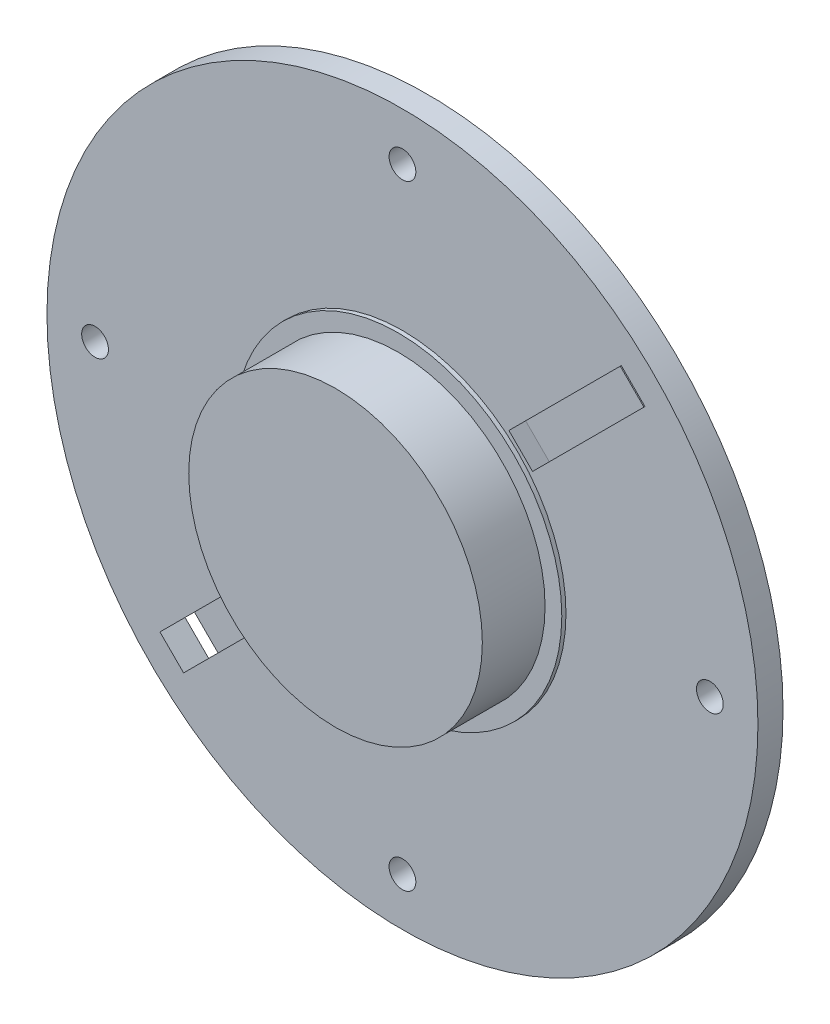
ISO-10303-21;
HEADER;
FILE_DESCRIPTION(('STEP AP214'),'2;1');
FILE_NAME('part.step','',(''),(''),'','','');
FILE_SCHEMA(('AUTOMOTIVE_DESIGN { 1 0 10303 214 1 1 1 1 }'));
ENDSEC;
DATA;
#1=APPLICATION_CONTEXT('core data for automotive mechanical design processes');
#2=APPLICATION_PROTOCOL_DEFINITION('international standard','automotive_design',2000,#1);
#3=PRODUCT_CONTEXT('',#1,'mechanical');
#4=PRODUCT('Part','Part','',(#3));
#5=PRODUCT_RELATED_PRODUCT_CATEGORY('part','',(#4));
#6=PRODUCT_DEFINITION_FORMATION('','',#4);
#7=PRODUCT_DEFINITION_CONTEXT('part definition',#1,'design');
#8=PRODUCT_DEFINITION('design','',#6,#7);
#9=PRODUCT_DEFINITION_SHAPE('','',#8);
#10=(LENGTH_UNIT() NAMED_UNIT(*) SI_UNIT(.MILLI.,.METRE.));
#11=(NAMED_UNIT(*) PLANE_ANGLE_UNIT() SI_UNIT($,.RADIAN.));
#12=(NAMED_UNIT(*) SI_UNIT($,.STERADIAN.) SOLID_ANGLE_UNIT());
#13=UNCERTAINTY_MEASURE_WITH_UNIT(LENGTH_MEASURE(1.E-05),#10,'distance_accuracy_value','');
#14=(GEOMETRIC_REPRESENTATION_CONTEXT(3) GLOBAL_UNCERTAINTY_ASSIGNED_CONTEXT((#13)) GLOBAL_UNIT_ASSIGNED_CONTEXT((#10,
#11,#12)) REPRESENTATION_CONTEXT('',''));
#15=CARTESIAN_POINT('',(0.,0.,0.));
#16=DIRECTION('',(0.,0.,1.));
#17=DIRECTION('',(1.,0.,0.));
#18=AXIS2_PLACEMENT_3D('',#15,#16,#17);
#19=CARTESIAN_POINT('',(0.,42.5,3.));
#20=DIRECTION('',(0.,0.,-1.));
#21=DIRECTION('',(-1.,0.,0.));
#22=AXIS2_PLACEMENT_3D('',#19,#20,#21);
#23=PLANE('',#22);
#24=DIRECTION('',(0.707106781186546,0.707106781186549,0.));
#25=VECTOR('',#24,1.);
#26=CARTESIAN_POINT('',(28.9913780286484,26.1629509039023,3.));
#27=LINE('',#26,#25);
#28=CARTESIAN_POINT('',(15.556349186104,12.7279220613579,3.));
#29=VERTEX_POINT('',#28);
#30=CARTESIAN_POINT('',(28.9913780286484,26.1629509039023,3.));
#31=VERTEX_POINT('',#30);
#32=EDGE_CURVE('E239',#29,#31,#27,.T.);
#33=ORIENTED_EDGE('',*,*,#32,.F.);
#34=DIRECTION('',(-0.707106781186549,0.707106781186546,0.));
#35=VECTOR('',#34,1.);
#36=CARTESIAN_POINT('',(15.556349186104,12.7279220613579,3.));
#37=LINE('',#36,#35);
#38=CARTESIAN_POINT('',(12.7279220613578,15.5563491861041,3.));
#39=VERTEX_POINT('',#38);
#40=EDGE_CURVE('E306',#29,#39,#37,.T.);
#41=ORIENTED_EDGE('',*,*,#40,.T.);
#42=DIRECTION('',(0.707106781186546,0.707106781186549,0.));
#43=VECTOR('',#42,1.);
#44=CARTESIAN_POINT('',(26.1629509039022,28.9913780286485,3.));
#45=LINE('',#44,#43);
#46=CARTESIAN_POINT('',(26.1629509039022,28.9913780286485,3.));
#47=VERTEX_POINT('',#46);
#48=EDGE_CURVE('E281',#39,#47,#45,.T.);
#49=ORIENTED_EDGE('',*,*,#48,.T.);
#50=DIRECTION('',(-0.707106781186549,0.707106781186546,0.));
#51=VECTOR('',#50,1.);
#52=CARTESIAN_POINT('',(28.9913780286484,26.1629509039023,3.));
#53=LINE('',#52,#51);
#54=EDGE_CURVE('E304',#31,#47,#53,.T.);
#55=ORIENTED_EDGE('',*,*,#54,.F.);
#56=EDGE_LOOP('',(#33,#41,#49,#55));
#57=FACE_BOUND('',#56,.T.);
#58=CARTESIAN_POINT('',(0.,36.75,3.));
#59=DIRECTION('',(0.,0.,-1.));
#60=DIRECTION('',(-1.,0.,0.));
#61=AXIS2_PLACEMENT_3D('',#58,#59,#60);
#62=CIRCLE('',#61,1.6);
#63=CARTESIAN_POINT('',(-1.6,36.75,3.));
#64=VERTEX_POINT('',#63);
#65=EDGE_CURVE('E379',#64,#64,#62,.T.);
#66=ORIENTED_EDGE('',*,*,#65,.T.);
#67=EDGE_LOOP('',(#66));
#68=FACE_BOUND('',#67,.T.);
#69=CARTESIAN_POINT('',(36.75,0.,3.));
#70=DIRECTION('',(0.,0.,-1.));
#71=DIRECTION('',(-1.,0.,0.));
#72=AXIS2_PLACEMENT_3D('',#69,#70,#71);
#73=CIRCLE('',#72,1.6);
#74=CARTESIAN_POINT('',(35.15,0.,3.));
#75=VERTEX_POINT('',#74);
#76=EDGE_CURVE('E376',#75,#75,#73,.T.);
#77=ORIENTED_EDGE('',*,*,#76,.T.);
#78=EDGE_LOOP('',(#77));
#79=FACE_BOUND('',#78,.T.);
#80=CARTESIAN_POINT('',(-36.75,0.,3.));
#81=DIRECTION('',(0.,0.,-1.));
#82=DIRECTION('',(-1.,0.,0.));
#83=AXIS2_PLACEMENT_3D('',#80,#81,#82);
#84=CIRCLE('',#83,1.60000000000001);
#85=CARTESIAN_POINT('',(-38.35,0.,3.));
#86=VERTEX_POINT('',#85);
#87=EDGE_CURVE('E373',#86,#86,#84,.T.);
#88=ORIENTED_EDGE('',*,*,#87,.T.);
#89=EDGE_LOOP('',(#88));
#90=FACE_BOUND('',#89,.T.);
#91=CARTESIAN_POINT('',(0.,-36.75,3.));
#92=DIRECTION('',(0.,0.,-1.));
#93=DIRECTION('',(-1.,0.,0.));
#94=AXIS2_PLACEMENT_3D('',#91,#92,#93);
#95=CIRCLE('',#94,1.6);
#96=CARTESIAN_POINT('',(-1.60000000000001,-36.75,3.));
#97=VERTEX_POINT('',#96);
#98=EDGE_CURVE('E361',#97,#97,#95,.T.);
#99=ORIENTED_EDGE('',*,*,#98,.T.);
#100=EDGE_LOOP('',(#99));
#101=FACE_BOUND('',#100,.T.);
#102=CARTESIAN_POINT('',(0.,0.,3.));
#103=DIRECTION('',(0.,0.,1.));
#104=DIRECTION('',(1.,0.,0.));
#105=AXIS2_PLACEMENT_3D('',#102,#103,#104);
#106=CIRCLE('',#105,19.55);
#107=CARTESIAN_POINT('',(19.55,0.,3.));
#108=VERTEX_POINT('',#107);
#109=EDGE_CURVE('E51',#108,#108,#106,.T.);
#110=ORIENTED_EDGE('',*,*,#109,.F.);
#111=EDGE_LOOP('',(#110));
#112=FACE_BOUND('',#111,.T.);
#113=CARTESIAN_POINT('',(0.,0.,3.));
#114=DIRECTION('',(0.,0.,1.));
#115=DIRECTION('',(1.,0.,0.));
#116=AXIS2_PLACEMENT_3D('',#113,#114,#115);
#117=CIRCLE('',#116,42.5);
#118=CARTESIAN_POINT('',(42.5,0.,3.));
#119=VERTEX_POINT('',#118);
#120=EDGE_CURVE('E391',#119,#119,#117,.T.);
#121=ORIENTED_EDGE('',*,*,#120,.T.);
#122=EDGE_LOOP('',(#121));
#123=FACE_BOUND('',#122,.T.);
#124=DIRECTION('',(0.707106781186546,0.707106781186549,0.));
#125=VECTOR('',#124,1.);
#126=CARTESIAN_POINT('',(-26.1629509039022,-28.9913780286485,3.00000000000001));
#127=LINE('',#126,#125);
#128=CARTESIAN_POINT('',(-26.1629509039022,-28.9913780286485,3.00000000000001));
#129=VERTEX_POINT('',#128);
#130=CARTESIAN_POINT('',(-12.7279220613578,-15.5563491861041,3.));
#131=VERTEX_POINT('',#130);
#132=EDGE_CURVE('E227',#129,#131,#127,.T.);
#133=ORIENTED_EDGE('',*,*,#132,.F.);
#134=DIRECTION('',(-0.707106781186549,0.707106781186546,0.));
#135=VECTOR('',#134,1.);
#136=CARTESIAN_POINT('',(-26.1629509039022,-28.9913780286485,3.00000000000001));
#137=LINE('',#136,#135);
#138=CARTESIAN_POINT('',(-28.9913780286484,-26.1629509039023,3.00000000000001));
#139=VERTEX_POINT('',#138);
#140=EDGE_CURVE('E316',#129,#139,#137,.T.);
#141=ORIENTED_EDGE('',*,*,#140,.T.);
#142=DIRECTION('',(0.707106781186546,0.707106781186549,0.));
#143=VECTOR('',#142,1.);
#144=CARTESIAN_POINT('',(-28.9913780286484,-26.1629509039023,3.00000000000001));
#145=LINE('',#144,#143);
#146=CARTESIAN_POINT('',(-15.556349186104,-12.7279220613579,3.));
#147=VERTEX_POINT('',#146);
#148=EDGE_CURVE('E270',#139,#147,#145,.T.);
#149=ORIENTED_EDGE('',*,*,#148,.T.);
#150=DIRECTION('',(-0.707106781186549,0.707106781186546,0.));
#151=VECTOR('',#150,1.);
#152=CARTESIAN_POINT('',(-12.7279220613578,-15.5563491861041,3.));
#153=LINE('',#152,#151);
#154=EDGE_CURVE('E314',#131,#147,#153,.T.);
#155=ORIENTED_EDGE('',*,*,#154,.F.);
#156=EDGE_LOOP('',(#133,#141,#149,#155));
#157=FACE_BOUND('',#156,.T.);
#158=ADVANCED_FACE('F43',(#57,#68,#79,#90,#101,#112,#123,#157),#23,.F.);
#159=CARTESIAN_POINT('',(0.,0.,0.));
#160=DIRECTION('',(0.,0.,1.));
#161=DIRECTION('',(1.,0.,0.));
#162=AXIS2_PLACEMENT_3D('',#159,#160,#161);
#163=PLANE('',#162);
#164=DIRECTION('',(-0.707106781186546,-0.707106781186549,0.));
#165=VECTOR('',#164,1.);
#166=CARTESIAN_POINT('',(-9.1923881554251,-12.0208152801713,0.));
#167=LINE('',#166,#165);
#168=CARTESIAN_POINT('',(12.0208152801713,9.19238815542514,0.));
#169=VERTEX_POINT('',#168);
#170=CARTESIAN_POINT('',(8.34241679264859,5.51398966790243,0.));
#171=VERTEX_POINT('',#170);
#172=EDGE_CURVE('E197',#169,#171,#167,.T.);
#173=ORIENTED_EDGE('',*,*,#172,.F.);
#174=DIRECTION('',(-0.707106781186549,0.707106781186546,0.));
#175=VECTOR('',#174,1.);
#176=CARTESIAN_POINT('',(12.0208152801713,9.19238815542514,0.));
#177=LINE('',#176,#175);
#178=CARTESIAN_POINT('',(9.1923881554251,12.0208152801713,0.));
#179=VERTEX_POINT('',#178);
#180=EDGE_CURVE('E182',#169,#179,#177,.T.);
#181=ORIENTED_EDGE('',*,*,#180,.T.);
#182=DIRECTION('',(-0.707106781186546,-0.707106781186549,0.));
#183=VECTOR('',#182,1.);
#184=CARTESIAN_POINT('',(-12.0208152801713,-9.19238815542514,0.));
#185=LINE('',#184,#183);
#186=CARTESIAN_POINT('',(5.5139896679024,8.34241679264861,0.));
#187=VERTEX_POINT('',#186);
#188=EDGE_CURVE('E253',#179,#187,#185,.T.);
#189=ORIENTED_EDGE('',*,*,#188,.T.);
#190=CARTESIAN_POINT('',(0.,0.,0.));
#191=DIRECTION('',(0.,0.,-1.));
#192=DIRECTION('',(-1.,0.,0.));
#193=AXIS2_PLACEMENT_3D('',#190,#191,#192);
#194=CIRCLE('',#193,10.);
#195=CARTESIAN_POINT('',(-8.34241679264859,-5.51398966790243,0.));
#196=VERTEX_POINT('',#195);
#197=EDGE_CURVE('E343',#196,#187,#194,.T.);
#198=ORIENTED_EDGE('',*,*,#197,.F.);
#199=CARTESIAN_POINT('',(-12.0208152801713,-9.19238815542514,0.));
#200=VERTEX_POINT('',#199);
#201=EDGE_CURVE('E252',#196,#200,#185,.T.);
#202=ORIENTED_EDGE('',*,*,#201,.T.);
#203=DIRECTION('',(-0.707106781186549,0.707106781186546,0.));
#204=VECTOR('',#203,1.);
#205=CARTESIAN_POINT('',(-9.1923881554251,-12.0208152801713,0.));
#206=LINE('',#205,#204);
#207=CARTESIAN_POINT('',(-9.1923881554251,-12.0208152801713,0.));
#208=VERTEX_POINT('',#207);
#209=EDGE_CURVE('E192',#208,#200,#206,.T.);
#210=ORIENTED_EDGE('',*,*,#209,.F.);
#211=CARTESIAN_POINT('',(-5.5139896679024,-8.34241679264861,0.));
#212=VERTEX_POINT('',#211);
#213=EDGE_CURVE('E201',#212,#208,#167,.T.);
#214=ORIENTED_EDGE('',*,*,#213,.F.);
#215=EDGE_CURVE('E209',#171,#212,#194,.T.);
#216=ORIENTED_EDGE('',*,*,#215,.F.);
#217=EDGE_LOOP('',(#173,#181,#189,#198,#202,#210,#214,#216));
#218=FACE_BOUND('',#217,.T.);
#219=DIRECTION('',(-0.707106781186546,-0.707106781186549,0.));
#220=VECTOR('',#219,1.);
#221=CARTESIAN_POINT('',(-24.0416305603426,-26.8700576850888,0.));
#222=LINE('',#221,#220);
#223=CARTESIAN_POINT('',(-24.0416305603426,-26.8700576850888,0.));
#224=VERTEX_POINT('',#223);
#225=CARTESIAN_POINT('',(-26.1629509039022,-28.9913780286485,0.));
#226=VERTEX_POINT('',#225);
#227=EDGE_CURVE('E221',#224,#226,#222,.T.);
#228=ORIENTED_EDGE('',*,*,#227,.F.);
#229=DIRECTION('',(-0.707106781186549,0.707106781186546,0.));
#230=VECTOR('',#229,1.);
#231=CARTESIAN_POINT('',(-24.0416305603426,-26.8700576850888,0.));
#232=LINE('',#231,#230);
#233=CARTESIAN_POINT('',(-26.8700576850888,-24.0416305603427,0.));
#234=VERTEX_POINT('',#233);
#235=EDGE_CURVE('E322',#224,#234,#232,.T.);
#236=ORIENTED_EDGE('',*,*,#235,.T.);
#237=DIRECTION('',(-0.707106781186546,-0.707106781186549,0.));
#238=VECTOR('',#237,1.);
#239=CARTESIAN_POINT('',(-26.8700576850888,-24.0416305603427,0.));
#240=LINE('',#239,#238);
#241=CARTESIAN_POINT('',(-28.9913780286484,-26.1629509039023,0.));
#242=VERTEX_POINT('',#241);
#243=EDGE_CURVE('E264',#234,#242,#240,.T.);
#244=ORIENTED_EDGE('',*,*,#243,.T.);
#245=DIRECTION('',(-0.707106781186549,0.707106781186546,0.));
#246=VECTOR('',#245,1.);
#247=CARTESIAN_POINT('',(-26.1629509039022,-28.9913780286485,0.));
#248=LINE('',#247,#246);
#249=EDGE_CURVE('E319',#226,#242,#248,.T.);
#250=ORIENTED_EDGE('',*,*,#249,.F.);
#251=EDGE_LOOP('',(#228,#236,#244,#250));
#252=FACE_BOUND('',#251,.T.);
#253=CARTESIAN_POINT('',(0.,36.75,0.));
#254=DIRECTION('',(0.,0.,-1.));
#255=DIRECTION('',(0.,1.,0.));
#256=AXIS2_PLACEMENT_3D('',#253,#254,#255);
#257=CIRCLE('',#256,1.6);
#258=CARTESIAN_POINT('',(0.,38.35,0.));
#259=VERTEX_POINT('',#258);
#260=EDGE_CURVE('E358',#259,#259,#257,.T.);
#261=ORIENTED_EDGE('',*,*,#260,.F.);
#262=EDGE_LOOP('',(#261));
#263=FACE_BOUND('',#262,.T.);
#264=CARTESIAN_POINT('',(36.75,0.,0.));
#265=DIRECTION('',(0.,0.,-1.));
#266=DIRECTION('',(0.,1.,0.));
#267=AXIS2_PLACEMENT_3D('',#264,#265,#266);
#268=CIRCLE('',#267,1.6);
#269=CARTESIAN_POINT('',(36.75,1.6,0.));
#270=VERTEX_POINT('',#269);
#271=EDGE_CURVE('E362',#270,#270,#268,.T.);
#272=ORIENTED_EDGE('',*,*,#271,.F.);
#273=EDGE_LOOP('',(#272));
#274=FACE_BOUND('',#273,.T.);
#275=CARTESIAN_POINT('',(-36.75,0.,0.));
#276=DIRECTION('',(0.,0.,-1.));
#277=DIRECTION('',(0.,1.,0.));
#278=AXIS2_PLACEMENT_3D('',#275,#276,#277);
#279=CIRCLE('',#278,1.60000000000001);
#280=CARTESIAN_POINT('',(-36.75,1.60000000000001,0.));
#281=VERTEX_POINT('',#280);
#282=EDGE_CURVE('E365',#281,#281,#279,.T.);
#283=ORIENTED_EDGE('',*,*,#282,.F.);
#284=EDGE_LOOP('',(#283));
#285=FACE_BOUND('',#284,.T.);
#286=CARTESIAN_POINT('',(0.,-36.75,0.));
#287=DIRECTION('',(0.,0.,-1.));
#288=DIRECTION('',(0.,1.,0.));
#289=AXIS2_PLACEMENT_3D('',#286,#287,#288);
#290=CIRCLE('',#289,1.6);
#291=CARTESIAN_POINT('',(0.,-35.15,0.));
#292=VERTEX_POINT('',#291);
#293=EDGE_CURVE('E368',#292,#292,#290,.T.);
#294=ORIENTED_EDGE('',*,*,#293,.F.);
#295=EDGE_LOOP('',(#294));
#296=FACE_BOUND('',#295,.T.);
#297=CARTESIAN_POINT('',(0.,0.,0.));
#298=DIRECTION('',(0.,0.,1.));
#299=DIRECTION('',(1.,0.,0.));
#300=AXIS2_PLACEMENT_3D('',#297,#298,#299);
#301=CIRCLE('',#300,42.5);
#302=CARTESIAN_POINT('',(42.5,0.,0.));
#303=VERTEX_POINT('',#302);
#304=EDGE_CURVE('E388',#303,#303,#301,.T.);
#305=ORIENTED_EDGE('',*,*,#304,.F.);
#306=EDGE_LOOP('',(#305));
#307=FACE_BOUND('',#306,.T.);
#308=DIRECTION('',(-0.707106781186546,-0.707106781186549,0.));
#309=VECTOR('',#308,1.);
#310=CARTESIAN_POINT('',(26.8700576850888,24.0416305603427,0.));
#311=LINE('',#310,#309);
#312=CARTESIAN_POINT('',(28.9913780286484,26.1629509039023,0.));
#313=VERTEX_POINT('',#312);
#314=CARTESIAN_POINT('',(26.8700576850888,24.0416305603427,0.));
#315=VERTEX_POINT('',#314);
#316=EDGE_CURVE('E245',#313,#315,#311,.T.);
#317=ORIENTED_EDGE('',*,*,#316,.F.);
#318=DIRECTION('',(-0.707106781186549,0.707106781186546,0.));
#319=VECTOR('',#318,1.);
#320=CARTESIAN_POINT('',(28.9913780286484,26.1629509039023,0.));
#321=LINE('',#320,#319);
#322=CARTESIAN_POINT('',(26.1629509039022,28.9913780286485,0.));
#323=VERTEX_POINT('',#322);
#324=EDGE_CURVE('E301',#313,#323,#321,.T.);
#325=ORIENTED_EDGE('',*,*,#324,.T.);
#326=DIRECTION('',(-0.707106781186546,-0.707106781186549,0.));
#327=VECTOR('',#326,1.);
#328=CARTESIAN_POINT('',(24.0416305603426,26.8700576850888,0.));
#329=LINE('',#328,#327);
#330=CARTESIAN_POINT('',(24.0416305603426,26.8700576850888,0.));
#331=VERTEX_POINT('',#330);
#332=EDGE_CURVE('E285',#323,#331,#329,.T.);
#333=ORIENTED_EDGE('',*,*,#332,.T.);
#334=DIRECTION('',(-0.707106781186549,0.707106781186546,0.));
#335=VECTOR('',#334,1.);
#336=CARTESIAN_POINT('',(26.8700576850888,24.0416305603427,0.));
#337=LINE('',#336,#335);
#338=EDGE_CURVE('E298',#315,#331,#337,.T.);
#339=ORIENTED_EDGE('',*,*,#338,.F.);
#340=EDGE_LOOP('',(#317,#325,#333,#339));
#341=FACE_BOUND('',#340,.T.);
#342=ADVANCED_FACE('F205',(#218,#252,#263,#274,#285,#296,#307,#341),#163,.F.);
#343=CARTESIAN_POINT('',(0.,0.,2.));
#344=DIRECTION('',(0.,0.,-1.));
#345=DIRECTION('',(-1.,0.,0.));
#346=AXIS2_PLACEMENT_3D('',#343,#344,#345);
#347=CYLINDRICAL_SURFACE('',#346,10.);
#348=DIRECTION('',(0.,0.,-1.));
#349=VECTOR('',#348,1.);
#350=CARTESIAN_POINT('',(8.3424167926486,5.51398966790242,2.));
#351=LINE('',#350,#349);
#352=CARTESIAN_POINT('',(8.34241679264859,5.51398966790243,2.));
#353=VERTEX_POINT('',#352);
#354=EDGE_CURVE('E337',#171,#353,#351,.F.);
#355=ORIENTED_EDGE('',*,*,#354,.F.);
#356=ORIENTED_EDGE('',*,*,#215,.T.);
#357=DIRECTION('',(0.,0.,-1.));
#358=VECTOR('',#357,1.);
#359=CARTESIAN_POINT('',(-5.5139896679024,-8.34241679264862,2.));
#360=LINE('',#359,#358);
#361=CARTESIAN_POINT('',(-5.5139896679024,-8.34241679264862,2.));
#362=VERTEX_POINT('',#361);
#363=EDGE_CURVE('E335',#362,#212,#360,.T.);
#364=ORIENTED_EDGE('',*,*,#363,.F.);
#365=CARTESIAN_POINT('',(0.,0.,2.));
#366=DIRECTION('',(0.,0.,-1.));
#367=DIRECTION('',(-1.,0.,0.));
#368=AXIS2_PLACEMENT_3D('',#365,#366,#367);
#369=CIRCLE('',#368,10.);
#370=EDGE_CURVE('E355',#353,#362,#369,.T.);
#371=ORIENTED_EDGE('',*,*,#370,.F.);
#372=EDGE_LOOP('',(#355,#356,#364,#371));
#373=FACE_BOUND('',#372,.T.);
#374=ADVANCED_FACE('F420',(#373),#347,.F.);
#375=CARTESIAN_POINT('',(0.,17.55,3.5));
#376=DIRECTION('',(0.,0.,-1.));
#377=DIRECTION('',(-1.,0.,0.));
#378=AXIS2_PLACEMENT_3D('',#375,#376,#377);
#379=PLANE('',#378);
#380=CARTESIAN_POINT('',(0.,0.,3.5));
#381=DIRECTION('',(0.,0.,1.));
#382=DIRECTION('',(1.,0.,0.));
#383=AXIS2_PLACEMENT_3D('',#380,#381,#382);
#384=CIRCLE('',#383,17.55);
#385=CARTESIAN_POINT('',(17.55,0.,3.5));
#386=VERTEX_POINT('',#385);
#387=EDGE_CURVE('E382',#386,#386,#384,.T.);
#388=ORIENTED_EDGE('',*,*,#387,.F.);
#389=EDGE_LOOP('',(#388));
#390=FACE_BOUND('',#389,.T.);
#391=CARTESIAN_POINT('',(0.,0.,3.5));
#392=DIRECTION('',(0.,0.,1.));
#393=DIRECTION('',(1.,0.,0.));
#394=AXIS2_PLACEMENT_3D('',#391,#392,#393);
#395=CIRCLE('',#394,19.55);
#396=CARTESIAN_POINT('',(19.55,0.,3.5));
#397=VERTEX_POINT('',#396);
#398=EDGE_CURVE('E11',#397,#397,#395,.T.);
#399=ORIENTED_EDGE('',*,*,#398,.T.);
#400=EDGE_LOOP('',(#399));
#401=FACE_BOUND('',#400,.T.);
#402=ADVANCED_FACE('F45',(#390,#401),#379,.F.);
#403=CARTESIAN_POINT('',(0.,0.,11.));
#404=DIRECTION('',(0.,0.,1.));
#405=DIRECTION('',(1.,0.,0.));
#406=AXIS2_PLACEMENT_3D('',#403,#404,#405);
#407=CYLINDRICAL_SURFACE('',#406,19.55);
#408=ORIENTED_EDGE('',*,*,#398,.F.);
#409=EDGE_LOOP('',(#408));
#410=FACE_BOUND('',#409,.T.);
#411=ORIENTED_EDGE('',*,*,#109,.T.);
#412=EDGE_LOOP('',(#411));
#413=FACE_BOUND('',#412,.T.);
#414=ADVANCED_FACE('F396',(#410,#413),#407,.T.);
#415=CARTESIAN_POINT('',(0.,0.,11.));
#416=DIRECTION('',(0.,0.,1.));
#417=DIRECTION('',(1.,0.,0.));
#418=AXIS2_PLACEMENT_3D('',#415,#416,#417);
#419=CYLINDRICAL_SURFACE('',#418,42.5);
#420=ORIENTED_EDGE('',*,*,#120,.F.);
#421=EDGE_LOOP('',(#420));
#422=FACE_BOUND('',#421,.T.);
#423=ORIENTED_EDGE('',*,*,#304,.T.);
#424=EDGE_LOOP('',(#423));
#425=FACE_BOUND('',#424,.T.);
#426=ADVANCED_FACE('F534',(#422,#425),#419,.T.);
#427=CARTESIAN_POINT('',(0.,17.55,11.));
#428=DIRECTION('',(0.,0.,-1.));
#429=DIRECTION('',(-1.,0.,0.));
#430=AXIS2_PLACEMENT_3D('',#427,#428,#429);
#431=PLANE('',#430);
#432=CARTESIAN_POINT('',(0.,0.,11.));
#433=DIRECTION('',(0.,0.,1.));
#434=DIRECTION('',(1.,0.,0.));
#435=AXIS2_PLACEMENT_3D('',#432,#433,#434);
#436=CIRCLE('',#435,17.55);
#437=CARTESIAN_POINT('',(17.55,0.,11.));
#438=VERTEX_POINT('',#437);
#439=EDGE_CURVE('E385',#438,#438,#436,.T.);
#440=ORIENTED_EDGE('',*,*,#439,.T.);
#441=EDGE_LOOP('',(#440));
#442=FACE_BOUND('',#441,.T.);
#443=ADVANCED_FACE('F531',(#442),#431,.F.);
#444=CARTESIAN_POINT('',(0.,0.,11.));
#445=DIRECTION('',(0.,0.,1.));
#446=DIRECTION('',(1.,0.,0.));
#447=AXIS2_PLACEMENT_3D('',#444,#445,#446);
#448=CYLINDRICAL_SURFACE('',#447,17.55);
#449=ORIENTED_EDGE('',*,*,#439,.F.);
#450=EDGE_LOOP('',(#449));
#451=FACE_BOUND('',#450,.T.);
#452=ORIENTED_EDGE('',*,*,#387,.T.);
#453=EDGE_LOOP('',(#452));
#454=FACE_BOUND('',#453,.T.);
#455=ADVANCED_FACE('F527',(#451,#454),#448,.T.);
#456=CARTESIAN_POINT('',(0.,-36.75,11.));
#457=DIRECTION('',(0.,0.,-1.));
#458=DIRECTION('',(0.,1.,0.));
#459=AXIS2_PLACEMENT_3D('',#456,#457,#458);
#460=CYLINDRICAL_SURFACE('',#459,1.6);
#461=ORIENTED_EDGE('',*,*,#293,.T.);
#462=EDGE_LOOP('',(#461));
#463=FACE_BOUND('',#462,.T.);
#464=ORIENTED_EDGE('',*,*,#98,.F.);
#465=EDGE_LOOP('',(#464));
#466=FACE_BOUND('',#465,.T.);
#467=ADVANCED_FACE('F523',(#463,#466),#460,.F.);
#468=CARTESIAN_POINT('',(-36.75,0.,11.));
#469=DIRECTION('',(0.,0.,-1.));
#470=DIRECTION('',(0.,1.,0.));
#471=AXIS2_PLACEMENT_3D('',#468,#469,#470);
#472=CYLINDRICAL_SURFACE('',#471,1.60000000000001);
#473=ORIENTED_EDGE('',*,*,#282,.T.);
#474=EDGE_LOOP('',(#473));
#475=FACE_BOUND('',#474,.T.);
#476=ORIENTED_EDGE('',*,*,#87,.F.);
#477=EDGE_LOOP('',(#476));
#478=FACE_BOUND('',#477,.T.);
#479=ADVANCED_FACE('F519',(#475,#478),#472,.F.);
#480=CARTESIAN_POINT('',(36.75,0.,11.));
#481=DIRECTION('',(0.,0.,-1.));
#482=DIRECTION('',(0.,1.,0.));
#483=AXIS2_PLACEMENT_3D('',#480,#481,#482);
#484=CYLINDRICAL_SURFACE('',#483,1.6);
#485=ORIENTED_EDGE('',*,*,#271,.T.);
#486=EDGE_LOOP('',(#485));
#487=FACE_BOUND('',#486,.T.);
#488=ORIENTED_EDGE('',*,*,#76,.F.);
#489=EDGE_LOOP('',(#488));
#490=FACE_BOUND('',#489,.T.);
#491=ADVANCED_FACE('F515',(#487,#490),#484,.F.);
#492=CARTESIAN_POINT('',(0.,36.75,11.));
#493=DIRECTION('',(0.,0.,-1.));
#494=DIRECTION('',(0.,1.,0.));
#495=AXIS2_PLACEMENT_3D('',#492,#493,#494);
#496=CYLINDRICAL_SURFACE('',#495,1.6);
#497=ORIENTED_EDGE('',*,*,#260,.T.);
#498=EDGE_LOOP('',(#497));
#499=FACE_BOUND('',#498,.T.);
#500=ORIENTED_EDGE('',*,*,#65,.F.);
#501=EDGE_LOOP('',(#500));
#502=FACE_BOUND('',#501,.T.);
#503=ADVANCED_FACE('F512',(#499,#502),#496,.F.);
#504=ORIENTED_EDGE('',*,*,#197,.T.);
#505=DIRECTION('',(0.,0.,-1.));
#506=VECTOR('',#505,1.);
#507=CARTESIAN_POINT('',(5.5139896679024,8.34241679264861,2.));
#508=LINE('',#507,#506);
#509=CARTESIAN_POINT('',(5.5139896679024,8.34241679264861,2.));
#510=VERTEX_POINT('',#509);
#511=EDGE_CURVE('E332',#187,#510,#508,.F.);
#512=ORIENTED_EDGE('',*,*,#511,.T.);
#513=CARTESIAN_POINT('',(-8.3424167926486,-5.51398966790243,2.));
#514=VERTEX_POINT('',#513);
#515=EDGE_CURVE('E352',#514,#510,#369,.T.);
#516=ORIENTED_EDGE('',*,*,#515,.F.);
#517=DIRECTION('',(0.,0.,-1.));
#518=VECTOR('',#517,1.);
#519=CARTESIAN_POINT('',(-8.34241679264859,-5.51398966790243,2.));
#520=LINE('',#519,#518);
#521=EDGE_CURVE('E295',#514,#196,#520,.T.);
#522=ORIENTED_EDGE('',*,*,#521,.T.);
#523=EDGE_LOOP('',(#504,#512,#516,#522));
#524=FACE_BOUND('',#523,.T.);
#525=ADVANCED_FACE('F453',(#524),#347,.F.);
#526=CARTESIAN_POINT('',(0.,0.,2.));
#527=DIRECTION('',(0.,0.,-1.));
#528=DIRECTION('',(-1.,0.,0.));
#529=AXIS2_PLACEMENT_3D('',#526,#527,#528);
#530=PLANE('',#529);
#531=ORIENTED_EDGE('',*,*,#515,.T.);
#532=DIRECTION('',(0.707106781186546,0.707106781186549,0.));
#533=VECTOR('',#532,1.);
#534=CARTESIAN_POINT('',(9.1923881554251,12.0208152801713,2.));
#535=LINE('',#534,#533);
#536=CARTESIAN_POINT('',(9.1923881554251,12.0208152801713,2.));
#537=VERTEX_POINT('',#536);
#538=EDGE_CURVE('E274',#510,#537,#535,.T.);
#539=ORIENTED_EDGE('',*,*,#538,.T.);
#540=DIRECTION('',(-0.707106781186549,0.707106781186546,0.));
#541=VECTOR('',#540,1.);
#542=CARTESIAN_POINT('',(12.0208152801713,9.19238815542514,2.));
#543=LINE('',#542,#541);
#544=CARTESIAN_POINT('',(12.0208152801713,9.19238815542514,2.));
#545=VERTEX_POINT('',#544);
#546=EDGE_CURVE('E309',#545,#537,#543,.T.);
#547=ORIENTED_EDGE('',*,*,#546,.F.);
#548=DIRECTION('',(0.707106781186546,0.707106781186549,0.));
#549=VECTOR('',#548,1.);
#550=CARTESIAN_POINT('',(12.0208152801713,9.19238815542514,2.));
#551=LINE('',#550,#549);
#552=EDGE_CURVE('E233',#353,#545,#551,.T.);
#553=ORIENTED_EDGE('',*,*,#552,.F.);
#554=ORIENTED_EDGE('',*,*,#370,.T.);
#555=CARTESIAN_POINT('',(-9.1923881554251,-12.0208152801713,2.));
#556=VERTEX_POINT('',#555);
#557=EDGE_CURVE('E234',#556,#362,#551,.T.);
#558=ORIENTED_EDGE('',*,*,#557,.F.);
#559=DIRECTION('',(-0.707106781186549,0.707106781186546,0.));
#560=VECTOR('',#559,1.);
#561=CARTESIAN_POINT('',(-9.1923881554251,-12.0208152801713,2.));
#562=LINE('',#561,#560);
#563=CARTESIAN_POINT('',(-12.0208152801713,-9.19238815542514,2.));
#564=VERTEX_POINT('',#563);
#565=EDGE_CURVE('E312',#556,#564,#562,.T.);
#566=ORIENTED_EDGE('',*,*,#565,.T.);
#567=EDGE_CURVE('E275',#564,#514,#535,.T.);
#568=ORIENTED_EDGE('',*,*,#567,.T.);
#569=EDGE_LOOP('',(#531,#539,#547,#553,#554,#558,#566,#568));
#570=FACE_BOUND('',#569,.T.);
#571=CARTESIAN_POINT('',(-4.06586399182265,4.06586399182264,2.));
#572=DIRECTION('',(0.,0.,-1.));
#573=DIRECTION('',(-1.,0.,0.));
#574=AXIS2_PLACEMENT_3D('',#571,#572,#573);
#575=CIRCLE('',#574,1.5);
#576=CARTESIAN_POINT('',(-5.56586399182265,4.06586399182264,2.));
#577=VERTEX_POINT('',#576);
#578=EDGE_CURVE('E344',#577,#577,#575,.T.);
#579=ORIENTED_EDGE('',*,*,#578,.F.);
#580=EDGE_LOOP('',(#579));
#581=FACE_BOUND('',#580,.T.);
#582=CARTESIAN_POINT('',(4.06586399182265,-4.06586399182264,2.));
#583=DIRECTION('',(0.,0.,-1.));
#584=DIRECTION('',(-1.,0.,0.));
#585=AXIS2_PLACEMENT_3D('',#582,#583,#584);
#586=CIRCLE('',#585,1.5);
#587=CARTESIAN_POINT('',(2.56586399182265,-4.06586399182264,2.));
#588=VERTEX_POINT('',#587);
#589=EDGE_CURVE('E347',#588,#588,#586,.T.);
#590=ORIENTED_EDGE('',*,*,#589,.F.);
#591=EDGE_LOOP('',(#590));
#592=FACE_BOUND('',#591,.T.);
#593=ADVANCED_FACE('F447',(#570,#581,#592),#530,.T.);
#594=CARTESIAN_POINT('',(4.06586399182265,-4.06586399182264,6.));
#595=DIRECTION('',(0.,0.,-1.));
#596=DIRECTION('',(-1.,0.,0.));
#597=AXIS2_PLACEMENT_3D('',#594,#595,#596);
#598=CYLINDRICAL_SURFACE('',#597,1.5);
#599=CARTESIAN_POINT('',(4.06586399182265,-4.06586399182264,6.));
#600=DIRECTION('',(0.,0.,-1.));
#601=DIRECTION('',(-1.,0.,0.));
#602=AXIS2_PLACEMENT_3D('',#599,#600,#601);
#603=CIRCLE('',#602,1.5);
#604=CARTESIAN_POINT('',(2.56586399182265,-4.06586399182264,6.));
#605=VERTEX_POINT('',#604);
#606=EDGE_CURVE('E339',#605,#605,#603,.T.);
#607=ORIENTED_EDGE('',*,*,#606,.F.);
#608=EDGE_LOOP('',(#607));
#609=FACE_BOUND('',#608,.T.);
#610=ORIENTED_EDGE('',*,*,#589,.T.);
#611=EDGE_LOOP('',(#610));
#612=FACE_BOUND('',#611,.T.);
#613=ADVANCED_FACE('F501',(#609,#612),#598,.F.);
#614=CARTESIAN_POINT('',(4.06586399182265,-4.06586399182264,6.));
#615=DIRECTION('',(0.,0.,-1.));
#616=DIRECTION('',(-1.,0.,0.));
#617=AXIS2_PLACEMENT_3D('',#614,#615,#616);
#618=PLANE('',#617);
#619=ORIENTED_EDGE('',*,*,#606,.T.);
#620=EDGE_LOOP('',(#619));
#621=FACE_BOUND('',#620,.T.);
#622=ADVANCED_FACE('F499',(#621),#618,.T.);
#623=CARTESIAN_POINT('',(-4.06586399182265,4.06586399182264,6.));
#624=DIRECTION('',(0.,0.,-1.));
#625=DIRECTION('',(-1.,0.,0.));
#626=AXIS2_PLACEMENT_3D('',#623,#624,#625);
#627=CYLINDRICAL_SURFACE('',#626,1.5);
#628=CARTESIAN_POINT('',(-4.06586399182265,4.06586399182264,6.));
#629=DIRECTION('',(0.,0.,-1.));
#630=DIRECTION('',(-1.,0.,0.));
#631=AXIS2_PLACEMENT_3D('',#628,#629,#630);
#632=CIRCLE('',#631,1.5);
#633=CARTESIAN_POINT('',(-5.56586399182265,4.06586399182264,6.));
#634=VERTEX_POINT('',#633);
#635=EDGE_CURVE('E340',#634,#634,#632,.T.);
#636=ORIENTED_EDGE('',*,*,#635,.F.);
#637=EDGE_LOOP('',(#636));
#638=FACE_BOUND('',#637,.T.);
#639=ORIENTED_EDGE('',*,*,#578,.T.);
#640=EDGE_LOOP('',(#639));
#641=FACE_BOUND('',#640,.T.);
#642=ADVANCED_FACE('F495',(#638,#641),#627,.F.);
#643=CARTESIAN_POINT('',(-4.06586399182265,4.06586399182264,6.));
#644=DIRECTION('',(0.,0.,-1.));
#645=DIRECTION('',(-1.,0.,0.));
#646=AXIS2_PLACEMENT_3D('',#643,#644,#645);
#647=PLANE('',#646);
#648=ORIENTED_EDGE('',*,*,#635,.T.);
#649=EDGE_LOOP('',(#648));
#650=FACE_BOUND('',#649,.T.);
#651=ADVANCED_FACE('F486',(#650),#647,.T.);
#652=CARTESIAN_POINT('',(-12.7279220613578,-15.5563491861041,1.));
#653=DIRECTION('',(0.,0.,-1.));
#654=DIRECTION('',(0.,1.,0.));
#655=AXIS2_PLACEMENT_3D('',#652,#653,#654);
#656=PLANE('',#655);
#657=DIRECTION('',(-0.707106781186547,-0.707106781186549,0.));
#658=VECTOR('',#657,1.);
#659=CARTESIAN_POINT('',(-15.556349186104,-12.7279220613579,1.));
#660=LINE('',#659,#658);
#661=CARTESIAN_POINT('',(-15.556349186104,-12.7279220613579,1.));
#662=VERTEX_POINT('',#661);
#663=CARTESIAN_POINT('',(-26.8700576850888,-24.0416305603427,1.00000000000001));
#664=VERTEX_POINT('',#663);
#665=EDGE_CURVE('E258',#662,#664,#660,.T.);
#666=ORIENTED_EDGE('',*,*,#665,.T.);
#667=DIRECTION('',(-0.707106781186549,0.707106781186546,0.));
#668=VECTOR('',#667,1.);
#669=CARTESIAN_POINT('',(-24.0416305603426,-26.8700576850888,1.00000000000001));
#670=LINE('',#669,#668);
#671=CARTESIAN_POINT('',(-24.0416305603426,-26.8700576850888,1.00000000000001));
#672=VERTEX_POINT('',#671);
#673=EDGE_CURVE('E325',#672,#664,#670,.T.);
#674=ORIENTED_EDGE('',*,*,#673,.F.);
#675=DIRECTION('',(-0.707106781186547,-0.707106781186549,0.));
#676=VECTOR('',#675,1.);
#677=CARTESIAN_POINT('',(-12.7279220613578,-15.5563491861041,1.));
#678=LINE('',#677,#676);
#679=CARTESIAN_POINT('',(-12.7279220613578,-15.5563491861041,1.));
#680=VERTEX_POINT('',#679);
#681=EDGE_CURVE('E213',#680,#672,#678,.T.);
#682=ORIENTED_EDGE('',*,*,#681,.F.);
#683=DIRECTION('',(-0.707106781186549,0.707106781186546,0.));
#684=VECTOR('',#683,1.);
#685=CARTESIAN_POINT('',(-12.7279220613578,-15.5563491861041,1.));
#686=LINE('',#685,#684);
#687=EDGE_CURVE('E327',#680,#662,#686,.T.);
#688=ORIENTED_EDGE('',*,*,#687,.T.);
#689=EDGE_LOOP('',(#666,#674,#682,#688));
#690=FACE_BOUND('',#689,.T.);
#691=ADVANCED_FACE('F483',(#690),#656,.F.);
#692=CARTESIAN_POINT('',(-1.41421356237309,1.41421356237309,0.));
#693=DIRECTION('',(-0.707106781186549,0.707106781186546,0.));
#694=DIRECTION('',(-0.707106781186546,-0.707106781186549,0.));
#695=AXIS2_PLACEMENT_3D('',#692,#693,#694);
#696=PLANE('',#695);
#697=ORIENTED_EDGE('',*,*,#567,.F.);
#698=DIRECTION('',(0.693375245281535,0.693375245281537,-0.196116135138185));
#699=VECTOR('',#698,1.);
#700=CARTESIAN_POINT('',(-15.556349186104,-12.7279220613579,3.));
#701=LINE('',#700,#699);
#702=EDGE_CURVE('E58',#147,#564,#701,.T.);
#703=ORIENTED_EDGE('',*,*,#702,.F.);
#704=ORIENTED_EDGE('',*,*,#148,.F.);
#705=DIRECTION('',(0.,0.,1.));
#706=VECTOR('',#705,1.);
#707=CARTESIAN_POINT('',(-28.9913780286484,-26.1629509039023,0.));
#708=LINE('',#707,#706);
#709=EDGE_CURVE('E267',#242,#139,#708,.T.);
#710=ORIENTED_EDGE('',*,*,#709,.F.);
#711=ORIENTED_EDGE('',*,*,#243,.F.);
#712=DIRECTION('',(0.,0.,-1.));
#713=VECTOR('',#712,1.);
#714=CARTESIAN_POINT('',(-26.8700576850888,-24.0416305603427,1.00000000000001));
#715=LINE('',#714,#713);
#716=EDGE_CURVE('E261',#664,#234,#715,.T.);
#717=ORIENTED_EDGE('',*,*,#716,.F.);
#718=ORIENTED_EDGE('',*,*,#665,.F.);
#719=DIRECTION('',(-0.693375245281535,-0.693375245281537,0.196116135138184));
#720=VECTOR('',#719,1.);
#721=CARTESIAN_POINT('',(-12.0208152801713,-9.19238815542514,0.));
#722=LINE('',#721,#720);
#723=EDGE_CURVE('E255',#200,#662,#722,.T.);
#724=ORIENTED_EDGE('',*,*,#723,.F.);
#725=ORIENTED_EDGE('',*,*,#201,.F.);
#726=ORIENTED_EDGE('',*,*,#521,.F.);
#727=EDGE_LOOP('',(#697,#703,#704,#710,#711,#717,#718,#724,#725,#726));
#728=FACE_BOUND('',#727,.T.);
#729=ADVANCED_FACE('F412',(#728),#696,.F.);
#730=CARTESIAN_POINT('',(1.4142135623731,-1.4142135623731,0.));
#731=DIRECTION('',(-0.707106781186549,0.707106781186546,0.));
#732=DIRECTION('',(-0.707106781186546,-0.707106781186549,0.));
#733=AXIS2_PLACEMENT_3D('',#730,#731,#732);
#734=PLANE('',#733);
#735=ORIENTED_EDGE('',*,*,#363,.T.);
#736=ORIENTED_EDGE('',*,*,#213,.T.);
#737=DIRECTION('',(-0.693375245281535,-0.693375245281537,0.196116135138184));
#738=VECTOR('',#737,1.);
#739=CARTESIAN_POINT('',(-9.1923881554251,-12.0208152801713,0.));
#740=LINE('',#739,#738);
#741=EDGE_CURVE('E210',#208,#680,#740,.T.);
#742=ORIENTED_EDGE('',*,*,#741,.T.);
#743=ORIENTED_EDGE('',*,*,#681,.T.);
#744=DIRECTION('',(0.,0.,-1.));
#745=VECTOR('',#744,1.);
#746=CARTESIAN_POINT('',(-24.0416305603426,-26.8700576850888,1.00000000000001));
#747=LINE('',#746,#745);
#748=EDGE_CURVE('E218',#672,#224,#747,.T.);
#749=ORIENTED_EDGE('',*,*,#748,.T.);
#750=ORIENTED_EDGE('',*,*,#227,.T.);
#751=DIRECTION('',(0.,0.,1.));
#752=VECTOR('',#751,1.);
#753=CARTESIAN_POINT('',(-26.1629509039022,-28.9913780286485,0.));
#754=LINE('',#753,#752);
#755=EDGE_CURVE('E224',#226,#129,#754,.T.);
#756=ORIENTED_EDGE('',*,*,#755,.T.);
#757=ORIENTED_EDGE('',*,*,#132,.T.);
#758=DIRECTION('',(0.693375245281535,0.693375245281537,-0.196116135138185));
#759=VECTOR('',#758,1.);
#760=CARTESIAN_POINT('',(-12.7279220613578,-15.5563491861041,3.));
#761=LINE('',#760,#759);
#762=EDGE_CURVE('E230',#131,#556,#761,.T.);
#763=ORIENTED_EDGE('',*,*,#762,.T.);
#764=ORIENTED_EDGE('',*,*,#557,.T.);
#765=EDGE_LOOP('',(#735,#736,#742,#743,#749,#750,#756,#757,#763,#764));
#766=FACE_BOUND('',#765,.T.);
#767=ADVANCED_FACE('F407',(#766),#734,.T.);
#768=CARTESIAN_POINT('',(-9.1923881554251,-12.0208152801713,0.));
#769=DIRECTION('',(-0.138675049056307,-0.138675049056308,-0.98058067569092));
#770=DIRECTION('',(0.,0.990147542976674,-0.140028008402802));
#771=AXIS2_PLACEMENT_3D('',#768,#769,#770);
#772=PLANE('',#771);
#773=ORIENTED_EDGE('',*,*,#723,.T.);
#774=ORIENTED_EDGE('',*,*,#687,.F.);
#775=ORIENTED_EDGE('',*,*,#741,.F.);
#776=ORIENTED_EDGE('',*,*,#209,.T.);
#777=EDGE_LOOP('',(#773,#774,#775,#776));
#778=FACE_BOUND('',#777,.T.);
#779=ADVANCED_FACE('F482',(#778),#772,.F.);
#780=CARTESIAN_POINT('',(-24.0416305603426,-26.8700576850888,1.00000000000001));
#781=DIRECTION('',(0.707106781186546,0.707106781186549,0.));
#782=DIRECTION('',(-0.707106781186549,0.707106781186546,0.));
#783=AXIS2_PLACEMENT_3D('',#780,#781,#782);
#784=PLANE('',#783);
#785=ORIENTED_EDGE('',*,*,#716,.T.);
#786=ORIENTED_EDGE('',*,*,#235,.F.);
#787=ORIENTED_EDGE('',*,*,#748,.F.);
#788=ORIENTED_EDGE('',*,*,#673,.T.);
#789=EDGE_LOOP('',(#785,#786,#787,#788));
#790=FACE_BOUND('',#789,.T.);
#791=ADVANCED_FACE('F416',(#790),#784,.F.);
#792=CARTESIAN_POINT('',(-26.1629509039022,-28.9913780286485,0.));
#793=DIRECTION('',(-0.707106781186546,-0.707106781186549,0.));
#794=DIRECTION('',(0.707106781186549,-0.707106781186546,0.));
#795=AXIS2_PLACEMENT_3D('',#792,#793,#794);
#796=PLANE('',#795);
#797=ORIENTED_EDGE('',*,*,#709,.T.);
#798=ORIENTED_EDGE('',*,*,#140,.F.);
#799=ORIENTED_EDGE('',*,*,#755,.F.);
#800=ORIENTED_EDGE('',*,*,#249,.T.);
#801=EDGE_LOOP('',(#797,#798,#799,#800));
#802=FACE_BOUND('',#801,.T.);
#803=ADVANCED_FACE('F411',(#802),#796,.F.);
#804=CARTESIAN_POINT('',(-12.7279220613578,-15.5563491861041,3.));
#805=DIRECTION('',(0.138675049056308,0.138675049056308,0.98058067569092));
#806=DIRECTION('',(0.,-0.990147542976674,0.140028008402802));
#807=AXIS2_PLACEMENT_3D('',#804,#805,#806);
#808=PLANE('',#807);
#809=ORIENTED_EDGE('',*,*,#702,.T.);
#810=ORIENTED_EDGE('',*,*,#565,.F.);
#811=ORIENTED_EDGE('',*,*,#762,.F.);
#812=ORIENTED_EDGE('',*,*,#154,.T.);
#813=EDGE_LOOP('',(#809,#810,#811,#812));
#814=FACE_BOUND('',#813,.T.);
#815=ADVANCED_FACE('F474',(#814),#808,.F.);
#816=ORIENTED_EDGE('',*,*,#354,.T.);
#817=ORIENTED_EDGE('',*,*,#552,.T.);
#818=DIRECTION('',(0.693375245281535,0.693375245281537,0.196116135138185));
#819=VECTOR('',#818,1.);
#820=CARTESIAN_POINT('',(15.556349186104,12.7279220613579,3.));
#821=LINE('',#820,#819);
#822=EDGE_CURVE('E236',#545,#29,#821,.T.);
#823=ORIENTED_EDGE('',*,*,#822,.T.);
#824=ORIENTED_EDGE('',*,*,#32,.T.);
#825=DIRECTION('',(0.,0.,-1.));
#826=VECTOR('',#825,1.);
#827=CARTESIAN_POINT('',(28.9913780286484,26.1629509039023,0.));
#828=LINE('',#827,#826);
#829=EDGE_CURVE('E242',#31,#313,#828,.T.);
#830=ORIENTED_EDGE('',*,*,#829,.T.);
#831=ORIENTED_EDGE('',*,*,#316,.T.);
#832=DIRECTION('',(0.,0.,1.));
#833=VECTOR('',#832,1.);
#834=CARTESIAN_POINT('',(26.8700576850888,24.0416305603427,1.));
#835=LINE('',#834,#833);
#836=CARTESIAN_POINT('',(26.8700576850888,24.0416305603427,1.));
#837=VERTEX_POINT('',#836);
#838=EDGE_CURVE('E248',#315,#837,#835,.T.);
#839=ORIENTED_EDGE('',*,*,#838,.T.);
#840=DIRECTION('',(-0.707106781186547,-0.707106781186549,0.));
#841=VECTOR('',#840,1.);
#842=CARTESIAN_POINT('',(15.556349186104,12.7279220613579,1.));
#843=LINE('',#842,#841);
#844=CARTESIAN_POINT('',(15.556349186104,12.7279220613579,1.));
#845=VERTEX_POINT('',#844);
#846=EDGE_CURVE('E193',#837,#845,#843,.T.);
#847=ORIENTED_EDGE('',*,*,#846,.T.);
#848=DIRECTION('',(-0.693375245281535,-0.693375245281537,-0.196116135138184));
#849=VECTOR('',#848,1.);
#850=CARTESIAN_POINT('',(12.0208152801713,9.19238815542514,0.));
#851=LINE('',#850,#849);
#852=EDGE_CURVE('E185',#845,#169,#851,.T.);
#853=ORIENTED_EDGE('',*,*,#852,.T.);
#854=ORIENTED_EDGE('',*,*,#172,.T.);
#855=EDGE_LOOP('',(#816,#817,#823,#824,#830,#831,#839,#847,#853,#854));
#856=FACE_BOUND('',#855,.T.);
#857=ADVANCED_FACE('F196',(#856),#734,.T.);
#858=ORIENTED_EDGE('',*,*,#188,.F.);
#859=DIRECTION('',(-0.693375245281535,-0.693375245281537,-0.196116135138184));
#860=VECTOR('',#859,1.);
#861=CARTESIAN_POINT('',(9.1923881554251,12.0208152801713,0.));
#862=LINE('',#861,#860);
#863=CARTESIAN_POINT('',(12.7279220613578,15.5563491861041,1.));
#864=VERTEX_POINT('',#863);
#865=EDGE_CURVE('E188',#864,#179,#862,.T.);
#866=ORIENTED_EDGE('',*,*,#865,.F.);
#867=DIRECTION('',(-0.707106781186547,-0.707106781186549,0.));
#868=VECTOR('',#867,1.);
#869=CARTESIAN_POINT('',(12.7279220613578,15.5563491861041,1.));
#870=LINE('',#869,#868);
#871=CARTESIAN_POINT('',(24.0416305603426,26.8700576850888,1.));
#872=VERTEX_POINT('',#871);
#873=EDGE_CURVE('E202',#872,#864,#870,.T.);
#874=ORIENTED_EDGE('',*,*,#873,.F.);
#875=DIRECTION('',(0.,0.,1.));
#876=VECTOR('',#875,1.);
#877=CARTESIAN_POINT('',(24.0416305603426,26.8700576850888,1.));
#878=LINE('',#877,#876);
#879=EDGE_CURVE('E288',#331,#872,#878,.T.);
#880=ORIENTED_EDGE('',*,*,#879,.F.);
#881=ORIENTED_EDGE('',*,*,#332,.F.);
#882=DIRECTION('',(0.,0.,-1.));
#883=VECTOR('',#882,1.);
#884=CARTESIAN_POINT('',(26.1629509039022,28.9913780286485,0.));
#885=LINE('',#884,#883);
#886=EDGE_CURVE('E66',#47,#323,#885,.T.);
#887=ORIENTED_EDGE('',*,*,#886,.F.);
#888=ORIENTED_EDGE('',*,*,#48,.F.);
#889=DIRECTION('',(0.693375245281535,0.693375245281537,0.196116135138185));
#890=VECTOR('',#889,1.);
#891=CARTESIAN_POINT('',(12.7279220613578,15.5563491861041,3.));
#892=LINE('',#891,#890);
#893=EDGE_CURVE('E278',#537,#39,#892,.T.);
#894=ORIENTED_EDGE('',*,*,#893,.F.);
#895=ORIENTED_EDGE('',*,*,#538,.F.);
#896=ORIENTED_EDGE('',*,*,#511,.F.);
#897=EDGE_LOOP('',(#858,#866,#874,#880,#881,#887,#888,#894,#895,#896));
#898=FACE_BOUND('',#897,.T.);
#899=ADVANCED_FACE('F440',(#898),#696,.F.);
#900=CARTESIAN_POINT('',(12.0208152801713,9.19238815542514,0.));
#901=DIRECTION('',(0.138675049056307,0.138675049056308,-0.98058067569092));
#902=DIRECTION('',(0.,0.990147542976674,0.140028008402801));
#903=AXIS2_PLACEMENT_3D('',#900,#901,#902);
#904=PLANE('',#903);
#905=ORIENTED_EDGE('',*,*,#865,.T.);
#906=ORIENTED_EDGE('',*,*,#180,.F.);
#907=ORIENTED_EDGE('',*,*,#852,.F.);
#908=DIRECTION('',(-0.707106781186549,0.707106781186546,0.));
#909=VECTOR('',#908,1.);
#910=CARTESIAN_POINT('',(15.556349186104,12.7279220613579,1.));
#911=LINE('',#910,#909);
#912=EDGE_CURVE('E293',#845,#864,#911,.T.);
#913=ORIENTED_EDGE('',*,*,#912,.T.);
#914=EDGE_LOOP('',(#905,#906,#907,#913));
#915=FACE_BOUND('',#914,.T.);
#916=ADVANCED_FACE('F184',(#915),#904,.F.);
#917=CARTESIAN_POINT('',(15.556349186104,12.7279220613579,1.));
#918=DIRECTION('',(0.,0.,-1.));
#919=DIRECTION('',(-1.,0.,0.));
#920=AXIS2_PLACEMENT_3D('',#917,#918,#919);
#921=PLANE('',#920);
#922=ORIENTED_EDGE('',*,*,#873,.T.);
#923=ORIENTED_EDGE('',*,*,#912,.F.);
#924=ORIENTED_EDGE('',*,*,#846,.F.);
#925=DIRECTION('',(-0.707106781186549,0.707106781186546,0.));
#926=VECTOR('',#925,1.);
#927=CARTESIAN_POINT('',(26.8700576850888,24.0416305603427,1.));
#928=LINE('',#927,#926);
#929=EDGE_CURVE('E296',#837,#872,#928,.T.);
#930=ORIENTED_EDGE('',*,*,#929,.T.);
#931=EDGE_LOOP('',(#922,#923,#924,#930));
#932=FACE_BOUND('',#931,.T.);
#933=ADVANCED_FACE('F459',(#932),#921,.F.);
#934=CARTESIAN_POINT('',(26.8700576850888,24.0416305603427,1.));
#935=DIRECTION('',(-0.707106781186546,-0.707106781186549,0.));
#936=DIRECTION('',(0.707106781186549,-0.707106781186546,0.));
#937=AXIS2_PLACEMENT_3D('',#934,#935,#936);
#938=PLANE('',#937);
#939=ORIENTED_EDGE('',*,*,#879,.T.);
#940=ORIENTED_EDGE('',*,*,#929,.F.);
#941=ORIENTED_EDGE('',*,*,#838,.F.);
#942=ORIENTED_EDGE('',*,*,#338,.T.);
#943=EDGE_LOOP('',(#939,#940,#941,#942));
#944=FACE_BOUND('',#943,.T.);
#945=ADVANCED_FACE('F461',(#944),#938,.F.);
#946=CARTESIAN_POINT('',(28.9913780286484,26.1629509039023,0.));
#947=DIRECTION('',(0.707106781186546,0.707106781186549,0.));
#948=DIRECTION('',(-0.707106781186549,0.707106781186546,0.));
#949=AXIS2_PLACEMENT_3D('',#946,#947,#948);
#950=PLANE('',#949);
#951=ORIENTED_EDGE('',*,*,#886,.T.);
#952=ORIENTED_EDGE('',*,*,#324,.F.);
#953=ORIENTED_EDGE('',*,*,#829,.F.);
#954=ORIENTED_EDGE('',*,*,#54,.T.);
#955=EDGE_LOOP('',(#951,#952,#953,#954));
#956=FACE_BOUND('',#955,.T.);
#957=ADVANCED_FACE('F437',(#956),#950,.F.);
#958=CARTESIAN_POINT('',(15.556349186104,12.7279220613579,3.));
#959=DIRECTION('',(-0.138675049056307,-0.138675049056308,0.98058067569092));
#960=DIRECTION('',(0.,-0.990147542976674,-0.140028008402802));
#961=AXIS2_PLACEMENT_3D('',#958,#959,#960);
#962=PLANE('',#961);
#963=ORIENTED_EDGE('',*,*,#893,.T.);
#964=ORIENTED_EDGE('',*,*,#40,.F.);
#965=ORIENTED_EDGE('',*,*,#822,.F.);
#966=ORIENTED_EDGE('',*,*,#546,.T.);
#967=EDGE_LOOP('',(#963,#964,#965,#966));
#968=FACE_BOUND('',#967,.T.);
#969=ADVANCED_FACE('F442',(#968),#962,.F.);
#970=CLOSED_SHELL('',(#158,#342,#374,#402,#414,#426,#443,#455,#467,#479,#491,#503,#525,#593,
#613,#622,#642,#651,#691,#729,#767,#779,#791,#803,#815,#857,#899,#916,#933,#945,#957,#969));
#971=MANIFOLD_SOLID_BREP('B2',#970);
#972=ADVANCED_BREP_SHAPE_REPRESENTATION('',(#18,#971),#14);
#973=SHAPE_DEFINITION_REPRESENTATION(#9,#972);
ENDSEC;
END-ISO-10303-21;
